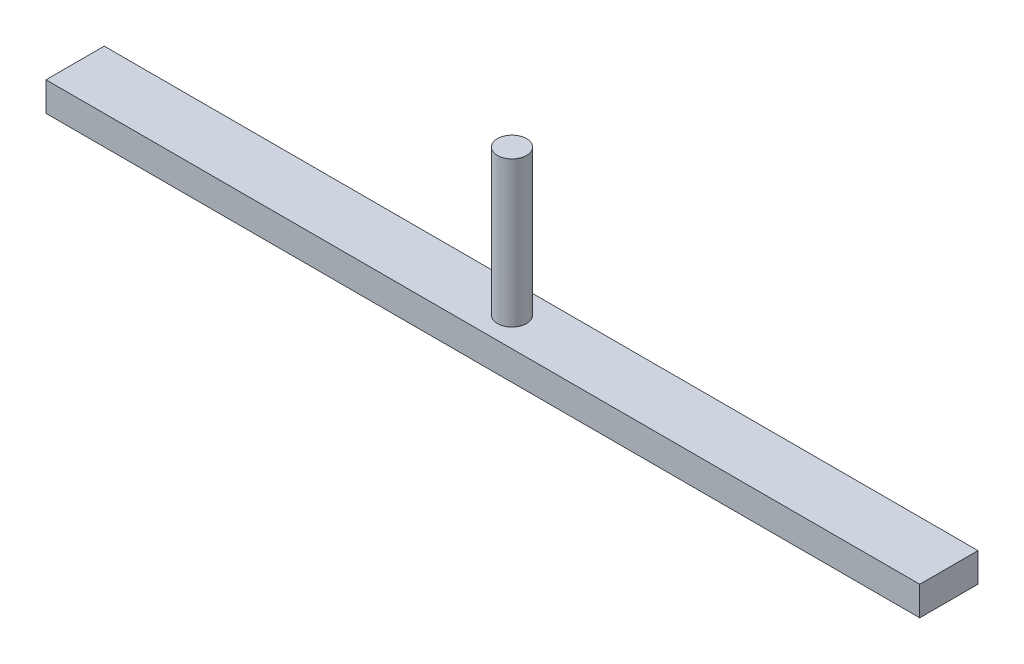
ISO-10303-21;
HEADER;
FILE_DESCRIPTION(('STEP AP214'),'2;1');
FILE_NAME('part.step','',(''),(''),'','','');
FILE_SCHEMA(('AUTOMOTIVE_DESIGN { 1 0 10303 214 1 1 1 1 }'));
ENDSEC;
DATA;
#1=APPLICATION_CONTEXT('core data for automotive mechanical design processes');
#2=APPLICATION_PROTOCOL_DEFINITION('international standard','automotive_design',2000,#1);
#3=PRODUCT_CONTEXT('',#1,'mechanical');
#4=PRODUCT('Part','Part','',(#3));
#5=PRODUCT_RELATED_PRODUCT_CATEGORY('part','',(#4));
#6=PRODUCT_DEFINITION_FORMATION('','',#4);
#7=PRODUCT_DEFINITION_CONTEXT('part definition',#1,'design');
#8=PRODUCT_DEFINITION('design','',#6,#7);
#9=PRODUCT_DEFINITION_SHAPE('','',#8);
#10=(LENGTH_UNIT() NAMED_UNIT(*) SI_UNIT(.MILLI.,.METRE.));
#11=(NAMED_UNIT(*) PLANE_ANGLE_UNIT() SI_UNIT($,.RADIAN.));
#12=(NAMED_UNIT(*) SI_UNIT($,.STERADIAN.) SOLID_ANGLE_UNIT());
#13=UNCERTAINTY_MEASURE_WITH_UNIT(LENGTH_MEASURE(1.E-05),#10,'distance_accuracy_value','');
#14=(GEOMETRIC_REPRESENTATION_CONTEXT(3) GLOBAL_UNCERTAINTY_ASSIGNED_CONTEXT((#13)) GLOBAL_UNIT_ASSIGNED_CONTEXT((#10,
#11,#12)) REPRESENTATION_CONTEXT('',''));
#15=CARTESIAN_POINT('',(0.,0.,0.));
#16=DIRECTION('',(0.,0.,1.));
#17=DIRECTION('',(1.,0.,0.));
#18=AXIS2_PLACEMENT_3D('',#15,#16,#17);
#19=CARTESIAN_POINT('',(75.,5.,-5.53970223325062));
#20=DIRECTION('',(-1.,0.,0.));
#21=DIRECTION('',(0.,0.,1.));
#22=AXIS2_PLACEMENT_3D('',#19,#20,#21);
#23=PLANE('',#22);
#24=DIRECTION('',(0.,0.,-1.));
#25=VECTOR('',#24,1.);
#26=CARTESIAN_POINT('',(75.,0.,-5.53970223325062));
#27=LINE('',#26,#25);
#28=CARTESIAN_POINT('',(75.,0.,-5.53970223325062));
#29=VERTEX_POINT('',#28);
#30=CARTESIAN_POINT('',(75.,0.,-15.5397022332506));
#31=VERTEX_POINT('',#30);
#32=EDGE_CURVE('E110',#29,#31,#27,.T.);
#33=ORIENTED_EDGE('',*,*,#32,.T.);
#34=DIRECTION('',(0.,-1.,0.));
#35=VECTOR('',#34,1.);
#36=CARTESIAN_POINT('',(75.,5.,-15.5397022332506));
#37=LINE('',#36,#35);
#38=CARTESIAN_POINT('',(75.,5.,-15.5397022332506));
#39=VERTEX_POINT('',#38);
#40=EDGE_CURVE('E48',#39,#31,#37,.T.);
#41=ORIENTED_EDGE('',*,*,#40,.F.);
#42=DIRECTION('',(0.,0.,-1.));
#43=VECTOR('',#42,1.);
#44=CARTESIAN_POINT('',(75.,5.,-5.53970223325062));
#45=LINE('',#44,#43);
#46=CARTESIAN_POINT('',(75.,5.,-5.53970223325062));
#47=VERTEX_POINT('',#46);
#48=EDGE_CURVE('E92',#47,#39,#45,.T.);
#49=ORIENTED_EDGE('',*,*,#48,.F.);
#50=DIRECTION('',(0.,-1.,0.));
#51=VECTOR('',#50,1.);
#52=CARTESIAN_POINT('',(75.,5.,-5.53970223325062));
#53=LINE('',#52,#51);
#54=EDGE_CURVE('E106',#47,#29,#53,.T.);
#55=ORIENTED_EDGE('',*,*,#54,.T.);
#56=EDGE_LOOP('',(#33,#41,#49,#55));
#57=FACE_BOUND('',#56,.T.);
#58=ADVANCED_FACE('F39',(#57),#23,.F.);
#59=CARTESIAN_POINT('',(-75.,5.,-15.5397022332506));
#60=DIRECTION('',(0.,0.,1.));
#61=DIRECTION('',(1.,0.,0.));
#62=AXIS2_PLACEMENT_3D('',#59,#60,#61);
#63=PLANE('',#62);
#64=DIRECTION('',(-1.,0.,0.));
#65=VECTOR('',#64,1.);
#66=CARTESIAN_POINT('',(-75.,0.,-15.5397022332506));
#67=LINE('',#66,#65);
#68=CARTESIAN_POINT('',(-75.,0.,-15.5397022332506));
#69=VERTEX_POINT('',#68);
#70=EDGE_CURVE('E98',#31,#69,#67,.T.);
#71=ORIENTED_EDGE('',*,*,#70,.T.);
#72=DIRECTION('',(0.,-1.,0.));
#73=VECTOR('',#72,1.);
#74=CARTESIAN_POINT('',(-75.,5.,-15.5397022332506));
#75=LINE('',#74,#73);
#76=CARTESIAN_POINT('',(-75.,5.,-15.5397022332506));
#77=VERTEX_POINT('',#76);
#78=EDGE_CURVE('E96',#77,#69,#75,.T.);
#79=ORIENTED_EDGE('',*,*,#78,.F.);
#80=DIRECTION('',(-1.,0.,0.));
#81=VECTOR('',#80,1.);
#82=CARTESIAN_POINT('',(-75.,5.,-15.5397022332506));
#83=LINE('',#82,#81);
#84=EDGE_CURVE('E87',#39,#77,#83,.T.);
#85=ORIENTED_EDGE('',*,*,#84,.F.);
#86=ORIENTED_EDGE('',*,*,#40,.T.);
#87=EDGE_LOOP('',(#71,#79,#85,#86));
#88=FACE_BOUND('',#87,.T.);
#89=ADVANCED_FACE('F97',(#88),#63,.F.);
#90=CARTESIAN_POINT('',(-75.,5.,-5.53970223325062));
#91=DIRECTION('',(1.,0.,0.));
#92=DIRECTION('',(0.,0.,-1.));
#93=AXIS2_PLACEMENT_3D('',#90,#91,#92);
#94=PLANE('',#93);
#95=DIRECTION('',(0.,0.,1.));
#96=VECTOR('',#95,1.);
#97=CARTESIAN_POINT('',(-75.,0.,-5.53970223325062));
#98=LINE('',#97,#96);
#99=CARTESIAN_POINT('',(-75.,0.,-5.53970223325062));
#100=VERTEX_POINT('',#99);
#101=EDGE_CURVE('E73',#69,#100,#98,.T.);
#102=ORIENTED_EDGE('',*,*,#101,.T.);
#103=DIRECTION('',(0.,-1.,0.));
#104=VECTOR('',#103,1.);
#105=CARTESIAN_POINT('',(-75.,5.,-5.53970223325062));
#106=LINE('',#105,#104);
#107=CARTESIAN_POINT('',(-75.,5.,-5.53970223325062));
#108=VERTEX_POINT('',#107);
#109=EDGE_CURVE('E100',#108,#100,#106,.T.);
#110=ORIENTED_EDGE('',*,*,#109,.F.);
#111=DIRECTION('',(0.,0.,1.));
#112=VECTOR('',#111,1.);
#113=CARTESIAN_POINT('',(-75.,5.,-5.53970223325062));
#114=LINE('',#113,#112);
#115=EDGE_CURVE('E90',#77,#108,#114,.T.);
#116=ORIENTED_EDGE('',*,*,#115,.F.);
#117=ORIENTED_EDGE('',*,*,#78,.T.);
#118=EDGE_LOOP('',(#102,#110,#116,#117));
#119=FACE_BOUND('',#118,.T.);
#120=ADVANCED_FACE('F102',(#119),#94,.F.);
#121=CARTESIAN_POINT('',(-75.,5.,-5.53970223325062));
#122=DIRECTION('',(0.,0.,-1.));
#123=DIRECTION('',(-1.,0.,0.));
#124=AXIS2_PLACEMENT_3D('',#121,#122,#123);
#125=PLANE('',#124);
#126=DIRECTION('',(1.,0.,0.));
#127=VECTOR('',#126,1.);
#128=CARTESIAN_POINT('',(-75.,0.,-5.53970223325062));
#129=LINE('',#128,#127);
#130=EDGE_CURVE('E79',#100,#29,#129,.T.);
#131=ORIENTED_EDGE('',*,*,#130,.T.);
#132=ORIENTED_EDGE('',*,*,#54,.F.);
#133=DIRECTION('',(1.,0.,0.));
#134=VECTOR('',#133,1.);
#135=CARTESIAN_POINT('',(-75.,5.,-5.53970223325062));
#136=LINE('',#135,#134);
#137=EDGE_CURVE('E56',#108,#47,#136,.T.);
#138=ORIENTED_EDGE('',*,*,#137,.F.);
#139=ORIENTED_EDGE('',*,*,#109,.T.);
#140=EDGE_LOOP('',(#131,#132,#138,#139));
#141=FACE_BOUND('',#140,.T.);
#142=ADVANCED_FACE('F139',(#141),#125,.F.);
#143=CARTESIAN_POINT('',(0.,5.,0.));
#144=DIRECTION('',(0.,-1.,0.));
#145=DIRECTION('',(0.,0.,-1.));
#146=AXIS2_PLACEMENT_3D('',#143,#144,#145);
#147=PLANE('',#146);
#148=CARTESIAN_POINT('',(0.,5.,-10.5397022332506));
#149=DIRECTION('',(0.,-1.,0.));
#150=DIRECTION('',(0.,0.,-1.));
#151=AXIS2_PLACEMENT_3D('',#148,#149,#150);
#152=CIRCLE('',#151,2.5);
#153=CARTESIAN_POINT('',(0.,5.,-13.0397022332506));
#154=VERTEX_POINT('',#153);
#155=EDGE_CURVE('E11',#154,#154,#152,.F.);
#156=ORIENTED_EDGE('',*,*,#155,.F.);
#157=EDGE_LOOP('',(#156));
#158=FACE_BOUND('',#157,.T.);
#159=ORIENTED_EDGE('',*,*,#48,.T.);
#160=ORIENTED_EDGE('',*,*,#84,.T.);
#161=ORIENTED_EDGE('',*,*,#115,.T.);
#162=ORIENTED_EDGE('',*,*,#137,.T.);
#163=EDGE_LOOP('',(#159,#160,#161,#162));
#164=FACE_BOUND('',#163,.T.);
#165=ADVANCED_FACE('F88',(#158,#164),#147,.F.);
#166=CARTESIAN_POINT('',(0.,0.,0.));
#167=DIRECTION('',(0.,-1.,0.));
#168=DIRECTION('',(0.,0.,-1.));
#169=AXIS2_PLACEMENT_3D('',#166,#167,#168);
#170=PLANE('',#169);
#171=ORIENTED_EDGE('',*,*,#32,.F.);
#172=ORIENTED_EDGE('',*,*,#130,.F.);
#173=ORIENTED_EDGE('',*,*,#101,.F.);
#174=ORIENTED_EDGE('',*,*,#70,.F.);
#175=EDGE_LOOP('',(#171,#172,#173,#174));
#176=FACE_BOUND('',#175,.T.);
#177=ADVANCED_FACE('F128',(#176),#170,.T.);
#178=CARTESIAN_POINT('',(0.,30.,-10.5397022332506));
#179=DIRECTION('',(0.,-1.,0.));
#180=DIRECTION('',(0.,0.,-1.));
#181=AXIS2_PLACEMENT_3D('',#178,#179,#180);
#182=CYLINDRICAL_SURFACE('',#181,2.5);
#183=CARTESIAN_POINT('',(0.,30.,-10.5397022332506));
#184=DIRECTION('',(0.,1.,0.));
#185=DIRECTION('',(0.,0.,1.));
#186=AXIS2_PLACEMENT_3D('',#183,#184,#185);
#187=CIRCLE('',#186,2.5);
#188=CARTESIAN_POINT('',(0.,30.,-8.03970223325062));
#189=VERTEX_POINT('',#188);
#190=EDGE_CURVE('E114',#189,#189,#187,.T.);
#191=ORIENTED_EDGE('',*,*,#190,.F.);
#192=EDGE_LOOP('',(#191));
#193=FACE_BOUND('',#192,.T.);
#194=ORIENTED_EDGE('',*,*,#155,.T.);
#195=EDGE_LOOP('',(#194));
#196=FACE_BOUND('',#195,.T.);
#197=ADVANCED_FACE('F130',(#193,#196),#182,.T.);
#198=CARTESIAN_POINT('',(0.,30.,-10.5397022332506));
#199=DIRECTION('',(0.,1.,0.));
#200=DIRECTION('',(0.,0.,1.));
#201=AXIS2_PLACEMENT_3D('',#198,#199,#200);
#202=PLANE('',#201);
#203=ORIENTED_EDGE('',*,*,#190,.T.);
#204=EDGE_LOOP('',(#203));
#205=FACE_BOUND('',#204,.T.);
#206=ADVANCED_FACE('F136',(#205),#202,.T.);
#207=CLOSED_SHELL('',(#58,#89,#120,#142,#165,#177,#197,#206));
#208=MANIFOLD_SOLID_BREP('B2',#207);
#209=ADVANCED_BREP_SHAPE_REPRESENTATION('',(#18,#208),#14);
#210=SHAPE_DEFINITION_REPRESENTATION(#9,#209);
ENDSEC;
END-ISO-10303-21;
